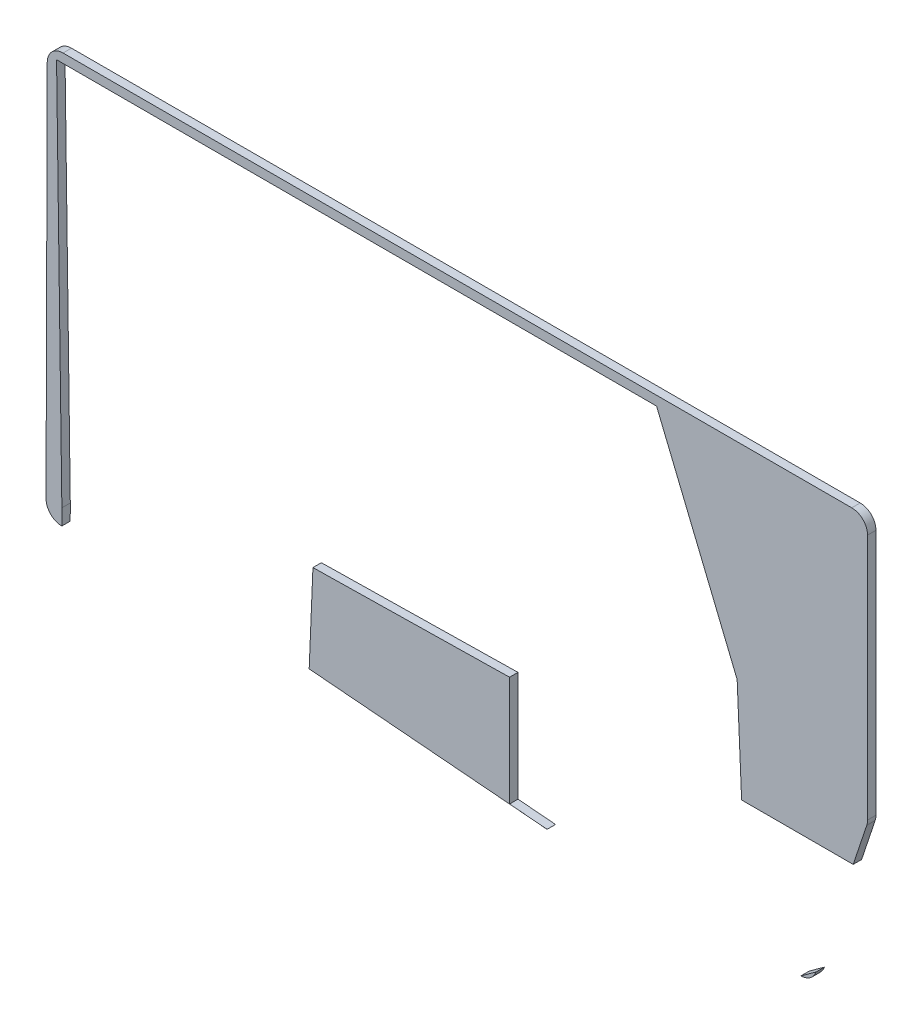
ISO-10303-21;
HEADER;
FILE_DESCRIPTION(('STEP AP214'),'2;1');
FILE_NAME('part.step','',(''),(''),'','','');
FILE_SCHEMA(('AUTOMOTIVE_DESIGN { 1 0 10303 214 1 1 1 1 }'));
ENDSEC;
DATA;
#1=APPLICATION_CONTEXT('core data for automotive mechanical design processes');
#2=APPLICATION_PROTOCOL_DEFINITION('international standard','automotive_design',2000,#1);
#3=PRODUCT_CONTEXT('',#1,'mechanical');
#4=PRODUCT('Part','Part','',(#3));
#5=PRODUCT_RELATED_PRODUCT_CATEGORY('part','',(#4));
#6=PRODUCT_DEFINITION_FORMATION('','',#4);
#7=PRODUCT_DEFINITION_CONTEXT('part definition',#1,'design');
#8=PRODUCT_DEFINITION('design','',#6,#7);
#9=PRODUCT_DEFINITION_SHAPE('','',#8);
#10=(LENGTH_UNIT() NAMED_UNIT(*) SI_UNIT(.MILLI.,.METRE.));
#11=(NAMED_UNIT(*) PLANE_ANGLE_UNIT() SI_UNIT($,.RADIAN.));
#12=(NAMED_UNIT(*) SI_UNIT($,.STERADIAN.) SOLID_ANGLE_UNIT());
#13=UNCERTAINTY_MEASURE_WITH_UNIT(LENGTH_MEASURE(1.E-05),#10,'distance_accuracy_value','');
#14=(GEOMETRIC_REPRESENTATION_CONTEXT(3) GLOBAL_UNCERTAINTY_ASSIGNED_CONTEXT((#13)) GLOBAL_UNIT_ASSIGNED_CONTEXT((#10,
#11,#12)) REPRESENTATION_CONTEXT('',''));
#15=CARTESIAN_POINT('',(0.,0.,0.));
#16=DIRECTION('',(0.,0.,1.));
#17=DIRECTION('',(1.,0.,0.));
#18=AXIS2_PLACEMENT_3D('',#15,#16,#17);
#19=CARTESIAN_POINT('',(194.025759523289,-168.3,1.6));
#20=DIRECTION('',(0.,0.,1.));
#21=DIRECTION('',(1.,0.,0.));
#22=AXIS2_PLACEMENT_3D('',#19,#20,#21);
#23=PLANE('',#22);
#24=DIRECTION('',(0.996542958828113,-0.0830790660161149,0.));
#25=VECTOR('',#24,1.);
#26=CARTESIAN_POINT('',(194.0257597,-171.3,1.6));
#27=LINE('',#26,#25);
#28=CARTESIAN_POINT('',(186.888780220454,-170.705009504022,1.6));
#29=VERTEX_POINT('',#28);
#30=CARTESIAN_POINT('',(194.0257597,-171.3,1.6));
#31=VERTEX_POINT('',#30);
#32=EDGE_CURVE('E169',#29,#31,#27,.T.);
#33=ORIENTED_EDGE('',*,*,#32,.F.);
#34=DIRECTION('',(0.,-1.,0.));
#35=VECTOR('',#34,1.);
#36=CARTESIAN_POINT('',(186.888780220454,-170.705009504022,1.6));
#37=LINE('',#36,#35);
#38=CARTESIAN_POINT('',(186.888780220454,-149.824825818157,1.6));
#39=VERTEX_POINT('',#38);
#40=EDGE_CURVE('E168',#39,#29,#37,.T.);
#41=ORIENTED_EDGE('',*,*,#40,.F.);
#42=DIRECTION('',(0.999854419750544,0.0170628047314592,0.));
#43=VECTOR('',#42,1.);
#44=CARTESIAN_POINT('',(186.888780220454,-149.824825818157,1.6));
#45=LINE('',#44,#43);
#46=CARTESIAN_POINT('',(149.504627314211,-150.46279719528,1.6));
#47=VERTEX_POINT('',#46);
#48=EDGE_CURVE('E165',#47,#39,#45,.T.);
#49=ORIENTED_EDGE('',*,*,#48,.F.);
#50=DIRECTION('',(0.0418230209844586,0.999125034675707,0.));
#51=VECTOR('',#50,1.);
#52=CARTESIAN_POINT('',(149.504627314211,-150.46279719528,1.6));
#53=LINE('',#52,#51);
#54=CARTESIAN_POINT('',(148.791233999381,-167.505304016625,1.6));
#55=VERTEX_POINT('',#54);
#56=EDGE_CURVE('E144',#55,#47,#53,.T.);
#57=ORIENTED_EDGE('',*,*,#56,.F.);
#58=DIRECTION('',(0.999999993640834,-0.000112775585568584,0.));
#59=VECTOR('',#58,1.);
#60=CARTESIAN_POINT('',(148.791233999381,-167.505304016625,1.6));
#61=LINE('',#60,#59);
#62=CARTESIAN_POINT('',(148.707395852683,-167.505294561729,1.6));
#63=VERTEX_POINT('',#62);
#64=EDGE_CURVE('E128',#63,#55,#61,.T.);
#65=ORIENTED_EDGE('',*,*,#64,.F.);
#66=CARTESIAN_POINT('',(148.529240476711,-170.5,1.6));
#67=DIRECTION('',(0.,0.,1.));
#68=DIRECTION('',(1.,0.,0.));
#69=AXIS2_PLACEMENT_3D('',#66,#67,#68);
#70=CIRCLE('',#69,2.99999999999998);
#71=CARTESIAN_POINT('',(148.7803178,-167.5105251,1.6));
#72=VERTEX_POINT('',#71);
#73=EDGE_CURVE('E141',#72,#63,#70,.T.);
#74=ORIENTED_EDGE('',*,*,#73,.F.);
#75=DIRECTION('',(0.996491626537751,-0.0836925220085229,0.));
#76=VECTOR('',#75,1.);
#77=CARTESIAN_POINT('',(148.7803178,-167.5105251,1.6));
#78=LINE('',#77,#76);
#79=CARTESIAN_POINT('',(193.7746822,-171.2894749,1.6));
#80=VERTEX_POINT('',#79);
#81=EDGE_CURVE('E157',#72,#80,#78,.T.);
#82=ORIENTED_EDGE('',*,*,#81,.T.);
#83=CARTESIAN_POINT('',(194.025759523289,-168.3,1.6));
#84=DIRECTION('',(0.,0.,1.));
#85=DIRECTION('',(1.,0.,0.));
#86=AXIS2_PLACEMENT_3D('',#83,#84,#85);
#87=CIRCLE('',#86,2.99999999999998);
#88=EDGE_CURVE('E159',#80,#31,#87,.T.);
#89=ORIENTED_EDGE('',*,*,#88,.T.);
#90=EDGE_LOOP('',(#33,#41,#49,#57,#65,#74,#82,#89));
#91=FACE_BOUND('',#90,.T.);
#92=ADVANCED_FACE('F56',(#91),#23,.T.);
#93=CARTESIAN_POINT('',(194.025759523289,-168.3,0.));
#94=DIRECTION('',(0.,0.,1.));
#95=DIRECTION('',(1.,0.,0.));
#96=AXIS2_PLACEMENT_3D('',#93,#94,#95);
#97=PLANE('',#96);
#98=DIRECTION('',(0.,-1.,0.));
#99=VECTOR('',#98,1.);
#100=CARTESIAN_POINT('',(186.888780220454,-170.705009504022,0.));
#101=LINE('',#100,#99);
#102=CARTESIAN_POINT('',(186.888780220454,-149.824825818157,0.));
#103=VERTEX_POINT('',#102);
#104=CARTESIAN_POINT('',(186.888780220454,-170.705009504022,0.));
#105=VERTEX_POINT('',#104);
#106=EDGE_CURVE('E161',#103,#105,#101,.T.);
#107=ORIENTED_EDGE('',*,*,#106,.T.);
#108=DIRECTION('',(0.996542958828113,-0.0830790660161149,0.));
#109=VECTOR('',#108,1.);
#110=CARTESIAN_POINT('',(194.0257597,-171.3,0.));
#111=LINE('',#110,#109);
#112=CARTESIAN_POINT('',(194.0257597,-171.3,0.));
#113=VERTEX_POINT('',#112);
#114=EDGE_CURVE('E175',#105,#113,#111,.T.);
#115=ORIENTED_EDGE('',*,*,#114,.T.);
#116=CARTESIAN_POINT('',(194.025759523289,-168.3,0.));
#117=DIRECTION('',(0.,0.,1.));
#118=DIRECTION('',(1.,0.,0.));
#119=AXIS2_PLACEMENT_3D('',#116,#117,#118);
#120=CIRCLE('',#119,2.99999999999998);
#121=CARTESIAN_POINT('',(193.7746822,-171.2894749,0.));
#122=VERTEX_POINT('',#121);
#123=EDGE_CURVE('E153',#122,#113,#120,.T.);
#124=ORIENTED_EDGE('',*,*,#123,.F.);
#125=DIRECTION('',(0.996491626537751,-0.0836925220085229,0.));
#126=VECTOR('',#125,1.);
#127=CARTESIAN_POINT('',(148.7803178,-167.5105251,0.));
#128=LINE('',#127,#126);
#129=CARTESIAN_POINT('',(148.7803178,-167.5105251,0.));
#130=VERTEX_POINT('',#129);
#131=EDGE_CURVE('E148',#130,#122,#128,.T.);
#132=ORIENTED_EDGE('',*,*,#131,.F.);
#133=CARTESIAN_POINT('',(148.529240476711,-170.5,0.));
#134=DIRECTION('',(0.,0.,1.));
#135=DIRECTION('',(1.,0.,0.));
#136=AXIS2_PLACEMENT_3D('',#133,#134,#135);
#137=CIRCLE('',#136,2.99999999999998);
#138=CARTESIAN_POINT('',(148.707395852683,-167.505294561729,0.));
#139=VERTEX_POINT('',#138);
#140=EDGE_CURVE('E178',#130,#139,#137,.T.);
#141=ORIENTED_EDGE('',*,*,#140,.T.);
#142=DIRECTION('',(0.999999993640834,-0.000112775585568585,0.));
#143=VECTOR('',#142,1.);
#144=CARTESIAN_POINT('',(194.025848570286,-167.510405376803,0.));
#145=LINE('',#144,#143);
#146=CARTESIAN_POINT('',(148.791233999381,-167.505304016625,0.));
#147=VERTEX_POINT('',#146);
#148=EDGE_CURVE('E130',#139,#147,#145,.T.);
#149=ORIENTED_EDGE('',*,*,#148,.T.);
#150=DIRECTION('',(0.0418230209844586,0.999125034675707,0.));
#151=VECTOR('',#150,1.);
#152=CARTESIAN_POINT('',(149.504627314211,-150.46279719528,0.));
#153=LINE('',#152,#151);
#154=CARTESIAN_POINT('',(149.504627314211,-150.46279719528,0.));
#155=VERTEX_POINT('',#154);
#156=EDGE_CURVE('E60',#147,#155,#153,.T.);
#157=ORIENTED_EDGE('',*,*,#156,.T.);
#158=DIRECTION('',(0.999854419750544,0.0170628047314592,0.));
#159=VECTOR('',#158,1.);
#160=CARTESIAN_POINT('',(186.888780220454,-149.824825818157,0.));
#161=LINE('',#160,#159);
#162=EDGE_CURVE('E180',#155,#103,#161,.T.);
#163=ORIENTED_EDGE('',*,*,#162,.T.);
#164=EDGE_LOOP('',(#107,#115,#124,#132,#141,#149,#157,#163));
#165=FACE_BOUND('',#164,.T.);
#166=ADVANCED_FACE('F58',(#165),#97,.F.);
#167=CARTESIAN_POINT('',(194.025759523289,-168.3,1.6));
#168=DIRECTION('',(0.,0.,-1.));
#169=DIRECTION('',(-1.,0.,0.));
#170=AXIS2_PLACEMENT_3D('',#167,#168,#169);
#171=CYLINDRICAL_SURFACE('',#170,2.99999999999998);
#172=ORIENTED_EDGE('',*,*,#123,.T.);
#173=DIRECTION('',(0.,0.,-1.));
#174=VECTOR('',#173,1.);
#175=CARTESIAN_POINT('',(194.0257597,-171.3,1.6));
#176=LINE('',#175,#174);
#177=EDGE_CURVE('E66',#31,#113,#176,.T.);
#178=ORIENTED_EDGE('',*,*,#177,.F.);
#179=ORIENTED_EDGE('',*,*,#88,.F.);
#180=DIRECTION('',(0.,0.,-1.));
#181=VECTOR('',#180,1.);
#182=CARTESIAN_POINT('',(193.7746822,-171.2894749,1.6));
#183=LINE('',#182,#181);
#184=EDGE_CURVE('E149',#80,#122,#183,.T.);
#185=ORIENTED_EDGE('',*,*,#184,.T.);
#186=EDGE_LOOP('',(#172,#178,#179,#185));
#187=FACE_BOUND('',#186,.T.);
#188=ADVANCED_FACE('F195',(#187),#171,.T.);
#189=CARTESIAN_POINT('',(148.529240476711,-170.5,1.6));
#190=DIRECTION('',(0.,0.,-1.));
#191=DIRECTION('',(-1.,0.,0.));
#192=AXIS2_PLACEMENT_3D('',#189,#190,#191);
#193=CYLINDRICAL_SURFACE('',#192,2.99999999999998);
#194=DIRECTION('',(0.,0.,-1.));
#195=VECTOR('',#194,1.);
#196=CARTESIAN_POINT('',(148.707395852683,-167.505294561729,1.6));
#197=LINE('',#196,#195);
#198=EDGE_CURVE('E125',#139,#63,#197,.F.);
#199=ORIENTED_EDGE('',*,*,#198,.F.);
#200=ORIENTED_EDGE('',*,*,#140,.F.);
#201=DIRECTION('',(0.,0.,-1.));
#202=VECTOR('',#201,1.);
#203=CARTESIAN_POINT('',(148.7803178,-167.5105251,1.6));
#204=LINE('',#203,#202);
#205=EDGE_CURVE('E135',#72,#130,#204,.T.);
#206=ORIENTED_EDGE('',*,*,#205,.F.);
#207=ORIENTED_EDGE('',*,*,#73,.T.);
#208=EDGE_LOOP('',(#199,#200,#206,#207));
#209=FACE_BOUND('',#208,.T.);
#210=ADVANCED_FACE('F146',(#209),#193,.F.);
#211=CARTESIAN_POINT('',(148.7803178,-167.5105251,1.6));
#212=DIRECTION('',(0.0836925220085229,0.996491626537751,0.));
#213=DIRECTION('',(-0.996491626537751,0.0836925220085229,0.));
#214=AXIS2_PLACEMENT_3D('',#211,#212,#213);
#215=PLANE('',#214);
#216=ORIENTED_EDGE('',*,*,#131,.T.);
#217=ORIENTED_EDGE('',*,*,#184,.F.);
#218=ORIENTED_EDGE('',*,*,#81,.F.);
#219=ORIENTED_EDGE('',*,*,#205,.T.);
#220=EDGE_LOOP('',(#216,#217,#218,#219));
#221=FACE_BOUND('',#220,.T.);
#222=ADVANCED_FACE('F190',(#221),#215,.F.);
#223=CARTESIAN_POINT('',(148.791233999381,-167.505304016625,0.));
#224=DIRECTION('',(-0.000112775585568584,-0.999999993640834,0.));
#225=DIRECTION('',(0.999999993640834,-0.000112775585568585,0.));
#226=AXIS2_PLACEMENT_3D('',#223,#224,#225);
#227=PLANE('',#226);
#228=ORIENTED_EDGE('',*,*,#198,.T.);
#229=ORIENTED_EDGE('',*,*,#64,.T.);
#230=DIRECTION('',(0.,0.,1.));
#231=VECTOR('',#230,1.);
#232=CARTESIAN_POINT('',(148.791233999381,-167.505304016625,0.));
#233=LINE('',#232,#231);
#234=EDGE_CURVE('E163',#147,#55,#233,.T.);
#235=ORIENTED_EDGE('',*,*,#234,.F.);
#236=ORIENTED_EDGE('',*,*,#148,.F.);
#237=EDGE_LOOP('',(#228,#229,#235,#236));
#238=FACE_BOUND('',#237,.T.);
#239=ADVANCED_FACE('F127',(#238),#227,.F.);
#240=CARTESIAN_POINT('',(149.504627314211,-150.46279719528,0.));
#241=DIRECTION('',(0.999125034675707,-0.0418230209844586,0.));
#242=DIRECTION('',(0.0418230209844586,0.999125034675707,0.));
#243=AXIS2_PLACEMENT_3D('',#240,#241,#242);
#244=PLANE('',#243);
#245=ORIENTED_EDGE('',*,*,#56,.T.);
#246=DIRECTION('',(0.,0.,1.));
#247=VECTOR('',#246,1.);
#248=CARTESIAN_POINT('',(149.504627314211,-150.46279719528,0.));
#249=LINE('',#248,#247);
#250=EDGE_CURVE('E166',#155,#47,#249,.T.);
#251=ORIENTED_EDGE('',*,*,#250,.F.);
#252=ORIENTED_EDGE('',*,*,#156,.F.);
#253=ORIENTED_EDGE('',*,*,#234,.T.);
#254=EDGE_LOOP('',(#245,#251,#252,#253));
#255=FACE_BOUND('',#254,.T.);
#256=ADVANCED_FACE('F202',(#255),#244,.F.);
#257=CARTESIAN_POINT('',(186.888780220454,-149.824825818157,0.));
#258=DIRECTION('',(0.0170628047314592,-0.999854419750544,0.));
#259=DIRECTION('',(0.999854419750544,0.0170628047314592,0.));
#260=AXIS2_PLACEMENT_3D('',#257,#258,#259);
#261=PLANE('',#260);
#262=ORIENTED_EDGE('',*,*,#48,.T.);
#263=DIRECTION('',(0.,0.,1.));
#264=VECTOR('',#263,1.);
#265=CARTESIAN_POINT('',(186.888780220454,-149.824825818157,0.));
#266=LINE('',#265,#264);
#267=EDGE_CURVE('E99',#103,#39,#266,.T.);
#268=ORIENTED_EDGE('',*,*,#267,.F.);
#269=ORIENTED_EDGE('',*,*,#162,.F.);
#270=ORIENTED_EDGE('',*,*,#250,.T.);
#271=EDGE_LOOP('',(#262,#268,#269,#270));
#272=FACE_BOUND('',#271,.T.);
#273=ADVANCED_FACE('F201',(#272),#261,.F.);
#274=CARTESIAN_POINT('',(186.888780220454,-170.705009504022,0.));
#275=DIRECTION('',(-1.,0.,0.));
#276=DIRECTION('',(0.,0.,1.));
#277=AXIS2_PLACEMENT_3D('',#274,#275,#276);
#278=PLANE('',#277);
#279=ORIENTED_EDGE('',*,*,#40,.T.);
#280=DIRECTION('',(0.,0.,1.));
#281=VECTOR('',#280,1.);
#282=CARTESIAN_POINT('',(186.888780220454,-170.705009504022,0.));
#283=LINE('',#282,#281);
#284=EDGE_CURVE('E12',#105,#29,#283,.T.);
#285=ORIENTED_EDGE('',*,*,#284,.F.);
#286=ORIENTED_EDGE('',*,*,#106,.F.);
#287=ORIENTED_EDGE('',*,*,#267,.T.);
#288=EDGE_LOOP('',(#279,#285,#286,#287));
#289=FACE_BOUND('',#288,.T.);
#290=ADVANCED_FACE('F200',(#289),#278,.F.);
#291=CARTESIAN_POINT('',(194.0257597,-171.3,0.));
#292=DIRECTION('',(-0.0830790660161149,-0.996542958828113,0.));
#293=DIRECTION('',(0.996542958828113,-0.0830790660161149,0.));
#294=AXIS2_PLACEMENT_3D('',#291,#292,#293);
#295=PLANE('',#294);
#296=ORIENTED_EDGE('',*,*,#32,.T.);
#297=ORIENTED_EDGE('',*,*,#177,.T.);
#298=ORIENTED_EDGE('',*,*,#114,.F.);
#299=ORIENTED_EDGE('',*,*,#284,.T.);
#300=EDGE_LOOP('',(#296,#297,#298,#299));
#301=FACE_BOUND('',#300,.T.);
#302=ADVANCED_FACE('F198',(#301),#295,.F.);
#303=CLOSED_SHELL('',(#92,#166,#188,#210,#222,#239,#256,#273,#290,#302));
#304=MANIFOLD_SOLID_BREP('B2',#303);
#305=CARTESIAN_POINT('',(251.95,-139.313167119495,1.6));
#306=DIRECTION('',(0.,0.,-1.));
#307=DIRECTION('',(-1.,0.,0.));
#308=AXIS2_PLACEMENT_3D('',#305,#306,#307);
#309=CYLINDRICAL_SURFACE('',#308,3.);
#310=CARTESIAN_POINT('',(251.95,-139.313167119495,0.));
#311=DIRECTION('',(0.,0.,1.));
#312=DIRECTION('',(1.,0.,0.));
#313=AXIS2_PLACEMENT_3D('',#310,#311,#312);
#314=CIRCLE('',#313,3.);
#315=CARTESIAN_POINT('',(254.7960499,-140.2618504,0.));
#316=VERTEX_POINT('',#315);
#317=CARTESIAN_POINT('',(254.95,-139.313167,0.));
#318=VERTEX_POINT('',#317);
#319=EDGE_CURVE('E451',#316,#318,#314,.T.);
#320=ORIENTED_EDGE('',*,*,#319,.T.);
#321=DIRECTION('',(0.,0.,-1.));
#322=VECTOR('',#321,1.);
#323=CARTESIAN_POINT('',(254.95,-139.313167,1.6));
#324=LINE('',#323,#322);
#325=CARTESIAN_POINT('',(254.95,-139.313167,1.6));
#326=VERTEX_POINT('',#325);
#327=EDGE_CURVE('E446',#326,#318,#324,.T.);
#328=ORIENTED_EDGE('',*,*,#327,.F.);
#329=CARTESIAN_POINT('',(251.95,-139.313167119495,1.6));
#330=DIRECTION('',(0.,0.,1.));
#331=DIRECTION('',(1.,0.,0.));
#332=AXIS2_PLACEMENT_3D('',#329,#330,#331);
#333=CIRCLE('',#332,3.);
#334=CARTESIAN_POINT('',(254.7960499,-140.2618504,1.6));
#335=VERTEX_POINT('',#334);
#336=EDGE_CURVE('E475',#335,#326,#333,.T.);
#337=ORIENTED_EDGE('',*,*,#336,.F.);
#338=DIRECTION('',(0.,0.,-1.));
#339=VECTOR('',#338,1.);
#340=CARTESIAN_POINT('',(254.7960499,-140.2618504,1.6));
#341=LINE('',#340,#339);
#342=EDGE_CURVE('E450',#335,#316,#341,.T.);
#343=ORIENTED_EDGE('',*,*,#342,.T.);
#344=EDGE_LOOP('',(#320,#328,#337,#343));
#345=FACE_BOUND('',#344,.T.);
#346=ADVANCED_FACE('F293',(#345),#309,.T.);
#347=CARTESIAN_POINT('',(254.95,-139.313167,1.6));
#348=DIRECTION('',(-1.,0.,0.));
#349=DIRECTION('',(0.,0.,1.));
#350=AXIS2_PLACEMENT_3D('',#347,#348,#349);
#351=PLANE('',#350);
#352=DIRECTION('',(0.,1.,0.));
#353=VECTOR('',#352,1.);
#354=CARTESIAN_POINT('',(254.95,-139.313167,0.));
#355=LINE('',#354,#353);
#356=CARTESIAN_POINT('',(254.95,-92.4019243,0.));
#357=VERTEX_POINT('',#356);
#358=EDGE_CURVE('E447',#318,#357,#355,.T.);
#359=ORIENTED_EDGE('',*,*,#358,.T.);
#360=DIRECTION('',(0.,0.,-1.));
#361=VECTOR('',#360,1.);
#362=CARTESIAN_POINT('',(254.95,-92.4019243,1.6));
#363=LINE('',#362,#361);
#364=CARTESIAN_POINT('',(254.95,-92.4019243,1.6));
#365=VERTEX_POINT('',#364);
#366=EDGE_CURVE('E442',#365,#357,#363,.T.);
#367=ORIENTED_EDGE('',*,*,#366,.F.);
#368=DIRECTION('',(0.,1.,0.));
#369=VECTOR('',#368,1.);
#370=CARTESIAN_POINT('',(254.95,-139.313167,1.6));
#371=LINE('',#370,#369);
#372=EDGE_CURVE('E472',#326,#365,#371,.T.);
#373=ORIENTED_EDGE('',*,*,#372,.F.);
#374=ORIENTED_EDGE('',*,*,#327,.T.);
#375=EDGE_LOOP('',(#359,#367,#373,#374));
#376=FACE_BOUND('',#375,.T.);
#377=ADVANCED_FACE('F563',(#376),#351,.F.);
#378=CARTESIAN_POINT('',(251.95,-92.4019242832938,1.6));
#379=DIRECTION('',(0.,0.,-1.));
#380=DIRECTION('',(-1.,0.,0.));
#381=AXIS2_PLACEMENT_3D('',#378,#379,#380);
#382=CYLINDRICAL_SURFACE('',#381,3.);
#383=CARTESIAN_POINT('',(251.95,-92.4019242832938,0.));
#384=DIRECTION('',(0.,0.,1.));
#385=DIRECTION('',(1.,0.,0.));
#386=AXIS2_PLACEMENT_3D('',#383,#384,#385);
#387=CIRCLE('',#386,3.);
#388=CARTESIAN_POINT('',(251.9480764,-89.4019249,0.));
#389=VERTEX_POINT('',#388);
#390=EDGE_CURVE('E443',#357,#389,#387,.T.);
#391=ORIENTED_EDGE('',*,*,#390,.T.);
#392=DIRECTION('',(0.,0.,-1.));
#393=VECTOR('',#392,1.);
#394=CARTESIAN_POINT('',(251.9480764,-89.4019249,1.6));
#395=LINE('',#394,#393);
#396=CARTESIAN_POINT('',(251.9480764,-89.4019249,1.6));
#397=VERTEX_POINT('',#396);
#398=EDGE_CURVE('E438',#397,#389,#395,.T.);
#399=ORIENTED_EDGE('',*,*,#398,.F.);
#400=CARTESIAN_POINT('',(251.95,-92.4019242832938,1.6));
#401=DIRECTION('',(0.,0.,1.));
#402=DIRECTION('',(1.,0.,0.));
#403=AXIS2_PLACEMENT_3D('',#400,#401,#402);
#404=CIRCLE('',#403,3.);
#405=EDGE_CURVE('E469',#365,#397,#404,.T.);
#406=ORIENTED_EDGE('',*,*,#405,.F.);
#407=ORIENTED_EDGE('',*,*,#366,.T.);
#408=EDGE_LOOP('',(#391,#399,#406,#407));
#409=FACE_BOUND('',#408,.T.);
#410=ADVANCED_FACE('F558',(#409),#382,.T.);
#411=CARTESIAN_POINT('',(251.9480764,-89.4019249,1.6));
#412=DIRECTION('',(0.000641231266330787,-0.99999979441121,0.));
#413=DIRECTION('',(0.999999794411211,0.000641231266330787,0.));
#414=AXIS2_PLACEMENT_3D('',#411,#412,#413);
#415=PLANE('',#414);
#416=DIRECTION('',(-0.99999979441121,-0.000641231266330787,0.));
#417=VECTOR('',#416,1.);
#418=CARTESIAN_POINT('',(251.9480764,-89.4019249,0.));
#419=LINE('',#418,#417);
#420=CARTESIAN_POINT('',(101.9884826,-89.4980837,0.));
#421=VERTEX_POINT('',#420);
#422=EDGE_CURVE('E439',#389,#421,#419,.T.);
#423=ORIENTED_EDGE('',*,*,#422,.T.);
#424=DIRECTION('',(0.,0.,-1.));
#425=VECTOR('',#424,1.);
#426=CARTESIAN_POINT('',(101.9884826,-89.4980837,1.6));
#427=LINE('',#426,#425);
#428=CARTESIAN_POINT('',(101.9884826,-89.4980837,1.6));
#429=VERTEX_POINT('',#428);
#430=EDGE_CURVE('E434',#429,#421,#427,.T.);
#431=ORIENTED_EDGE('',*,*,#430,.F.);
#432=DIRECTION('',(-0.99999979441121,-0.000641231266330787,0.));
#433=VECTOR('',#432,1.);
#434=CARTESIAN_POINT('',(251.9480764,-89.4019249,1.6));
#435=LINE('',#434,#433);
#436=EDGE_CURVE('E466',#397,#429,#435,.T.);
#437=ORIENTED_EDGE('',*,*,#436,.F.);
#438=ORIENTED_EDGE('',*,*,#398,.T.);
#439=EDGE_LOOP('',(#423,#431,#437,#438));
#440=FACE_BOUND('',#439,.T.);
#441=ADVANCED_FACE('F554',(#440),#415,.F.);
#442=CARTESIAN_POINT('',(101.990406191015,-92.4980830832995,1.6));
#443=DIRECTION('',(0.,0.,-1.));
#444=DIRECTION('',(-1.,0.,0.));
#445=AXIS2_PLACEMENT_3D('',#442,#443,#444);
#446=CYLINDRICAL_SURFACE('',#445,2.99999999999999);
#447=CARTESIAN_POINT('',(101.990406191015,-92.4980830832995,0.));
#448=DIRECTION('',(0.,0.,1.));
#449=DIRECTION('',(1.,0.,0.));
#450=AXIS2_PLACEMENT_3D('',#447,#448,#449);
#451=CIRCLE('',#450,2.99999999999999);
#452=CARTESIAN_POINT('',(98.9904216,-92.4884678,0.));
#453=VERTEX_POINT('',#452);
#454=EDGE_CURVE('E435',#421,#453,#451,.T.);
#455=ORIENTED_EDGE('',*,*,#454,.T.);
#456=DIRECTION('',(0.,0.,-1.));
#457=VECTOR('',#456,1.);
#458=CARTESIAN_POINT('',(98.9904216,-92.4884678,1.6));
#459=LINE('',#458,#457);
#460=CARTESIAN_POINT('',(98.9904216,-92.4884678,1.6));
#461=VERTEX_POINT('',#460);
#462=EDGE_CURVE('E433',#461,#453,#459,.T.);
#463=ORIENTED_EDGE('',*,*,#462,.F.);
#464=CARTESIAN_POINT('',(101.990406191015,-92.4980830832995,1.6));
#465=DIRECTION('',(0.,0.,1.));
#466=DIRECTION('',(1.,0.,0.));
#467=AXIS2_PLACEMENT_3D('',#464,#465,#466);
#468=CIRCLE('',#467,2.99999999999999);
#469=EDGE_CURVE('E463',#429,#461,#468,.T.);
#470=ORIENTED_EDGE('',*,*,#469,.F.);
#471=ORIENTED_EDGE('',*,*,#430,.T.);
#472=EDGE_LOOP('',(#455,#463,#470,#471));
#473=FACE_BOUND('',#472,.T.);
#474=ADVANCED_FACE('F550',(#473),#446,.T.);
#475=CARTESIAN_POINT('',(98.9904216,-92.4884678,1.6));
#476=DIRECTION('',(0.999994863615041,-0.00320511209401844,0.));
#477=DIRECTION('',(0.00320511209401844,0.999994863615041,0.));
#478=AXIS2_PLACEMENT_3D('',#475,#476,#477);
#479=PLANE('',#478);
#480=DIRECTION('',(-0.00320511209401844,-0.999994863615041,0.));
#481=VECTOR('',#480,1.);
#482=CARTESIAN_POINT('',(98.9904216,-92.4884678,0.));
#483=LINE('',#482,#481);
#484=CARTESIAN_POINT('',(98.7596462,-164.4903847,0.));
#485=VERTEX_POINT('',#484);
#486=EDGE_CURVE('E430',#453,#485,#483,.T.);
#487=ORIENTED_EDGE('',*,*,#486,.T.);
#488=DIRECTION('',(0.,0.,-1.));
#489=VECTOR('',#488,1.);
#490=CARTESIAN_POINT('',(98.7596462,-164.4903847,1.6));
#491=LINE('',#490,#489);
#492=CARTESIAN_POINT('',(98.7596462,-164.4903847,1.6));
#493=VERTEX_POINT('',#492);
#494=EDGE_CURVE('E423',#493,#485,#491,.T.);
#495=ORIENTED_EDGE('',*,*,#494,.F.);
#496=DIRECTION('',(-0.00320511209401844,-0.999994863615041,0.));
#497=VECTOR('',#496,1.);
#498=CARTESIAN_POINT('',(98.9904216,-92.4884678,1.6));
#499=LINE('',#498,#497);
#500=EDGE_CURVE('E460',#461,#493,#499,.T.);
#501=ORIENTED_EDGE('',*,*,#500,.F.);
#502=ORIENTED_EDGE('',*,*,#462,.T.);
#503=EDGE_LOOP('',(#487,#495,#501,#502));
#504=FACE_BOUND('',#503,.T.);
#505=ADVANCED_FACE('F544',(#504),#479,.F.);
#506=CARTESIAN_POINT('',(194.025759523289,-168.3,1.6));
#507=DIRECTION('',(0.,0.,1.));
#508=DIRECTION('',(1.,0.,0.));
#509=AXIS2_PLACEMENT_3D('',#506,#507,#508);
#510=PLANE('',#509);
#511=DIRECTION('',(-1.,0.,0.));
#512=VECTOR('',#511,1.);
#513=CARTESIAN_POINT('',(231.007722728077,-147.983990939871,1.6));
#514=LINE('',#513,#512);
#515=CARTESIAN_POINT('',(252.222003044496,-147.983990939871,1.6));
#516=VERTEX_POINT('',#515);
#517=CARTESIAN_POINT('',(231.007722728077,-147.983990939871,1.6));
#518=VERTEX_POINT('',#517);
#519=EDGE_CURVE('E485',#516,#518,#514,.T.);
#520=ORIENTED_EDGE('',*,*,#519,.F.);
#521=DIRECTION('',(0.316227766998681,0.948683297723233,0.));
#522=VECTOR('',#521,1.);
#523=CARTESIAN_POINT('',(245.1337722,-169.2486834,1.6));
#524=LINE('',#523,#522);
#525=EDGE_CURVE('E478',#516,#335,#524,.T.);
#526=ORIENTED_EDGE('',*,*,#525,.T.);
#527=ORIENTED_EDGE('',*,*,#336,.T.);
#528=ORIENTED_EDGE('',*,*,#372,.T.);
#529=ORIENTED_EDGE('',*,*,#405,.T.);
#530=ORIENTED_EDGE('',*,*,#436,.T.);
#531=ORIENTED_EDGE('',*,*,#469,.T.);
#532=ORIENTED_EDGE('',*,*,#500,.T.);
#533=CARTESIAN_POINT('',(101.759630790961,-164.5,1.6));
#534=DIRECTION('',(0.,0.,1.));
#535=DIRECTION('',(1.,0.,0.));
#536=AXIS2_PLACEMENT_3D('',#533,#534,#535);
#537=CIRCLE('',#536,3.);
#538=CARTESIAN_POINT('',(101.7596308,-167.5,1.6));
#539=VERTEX_POINT('',#538);
#540=EDGE_CURVE('E457',#493,#539,#537,.T.);
#541=ORIENTED_EDGE('',*,*,#540,.T.);
#542=DIRECTION('',(-0.00363238763850522,-0.999993402858261,0.));
#543=VECTOR('',#542,1.);
#544=CARTESIAN_POINT('',(101.7596308,-167.5,1.6));
#545=LINE('',#544,#543);
#546=CARTESIAN_POINT('',(101.770547,-164.494778897342,1.6));
#547=VERTEX_POINT('',#546);
#548=EDGE_CURVE('E405',#547,#539,#545,.T.);
#549=ORIENTED_EDGE('',*,*,#548,.F.);
#550=DIRECTION('',(0.0137757659029448,-0.999905109634803,0.));
#551=VECTOR('',#550,1.);
#552=CARTESIAN_POINT('',(101.770547,-164.494778897342,1.6));
#553=LINE('',#552,#551);
#554=CARTESIAN_POINT('',(100.760916,-91.211362,1.6));
#555=VERTEX_POINT('',#554);
#556=EDGE_CURVE('E304',#555,#547,#553,.T.);
#557=ORIENTED_EDGE('',*,*,#556,.F.);
#558=DIRECTION('',(-1.,0.,0.));
#559=VECTOR('',#558,1.);
#560=CARTESIAN_POINT('',(100.760916,-91.211362,1.6));
#561=LINE('',#560,#559);
#562=CARTESIAN_POINT('',(214.836347170596,-91.211362,1.6));
#563=VERTEX_POINT('',#562);
#564=EDGE_CURVE('E493',#563,#555,#561,.T.);
#565=ORIENTED_EDGE('',*,*,#564,.F.);
#566=DIRECTION('',(-0.379425861890164,0.925222143773541,0.));
#567=VECTOR('',#566,1.);
#568=CARTESIAN_POINT('',(214.836347170596,-91.211362,1.6));
#569=LINE('',#568,#567);
#570=CARTESIAN_POINT('',(230.15854555337,-128.574226946559,1.6));
#571=VERTEX_POINT('',#570);
#572=EDGE_CURVE('E488',#571,#563,#569,.T.);
#573=ORIENTED_EDGE('',*,*,#572,.F.);
#574=DIRECTION('',(-0.0437081898936154,0.999044340425501,0.));
#575=VECTOR('',#574,1.);
#576=CARTESIAN_POINT('',(230.15854555337,-128.574226946559,1.6));
#577=LINE('',#576,#575);
#578=EDGE_CURVE('E489',#518,#571,#577,.T.);
#579=ORIENTED_EDGE('',*,*,#578,.F.);
#580=EDGE_LOOP('',(#520,#526,#527,#528,#529,#530,#531,#532,#541,#549,#557,#565,#573,#579));
#581=FACE_BOUND('',#580,.T.);
#582=ADVANCED_FACE('F576',(#581),#510,.T.);
#583=CARTESIAN_POINT('',(194.025759523289,-168.3,0.));
#584=DIRECTION('',(0.,0.,1.));
#585=DIRECTION('',(1.,0.,0.));
#586=AXIS2_PLACEMENT_3D('',#583,#584,#585);
#587=PLANE('',#586);
#588=DIRECTION('',(0.316227766998681,0.948683297723233,0.));
#589=VECTOR('',#588,1.);
#590=CARTESIAN_POINT('',(245.1337722,-169.2486834,0.));
#591=LINE('',#590,#589);
#592=CARTESIAN_POINT('',(252.222003044496,-147.983990939871,0.));
#593=VERTEX_POINT('',#592);
#594=EDGE_CURVE('E454',#593,#316,#591,.T.);
#595=ORIENTED_EDGE('',*,*,#594,.F.);
#596=DIRECTION('',(-1.,0.,0.));
#597=VECTOR('',#596,1.);
#598=CARTESIAN_POINT('',(194.025759523289,-147.983990939871,0.));
#599=LINE('',#598,#597);
#600=CARTESIAN_POINT('',(231.007722728077,-147.983990939871,0.));
#601=VERTEX_POINT('',#600);
#602=EDGE_CURVE('E351',#593,#601,#599,.T.);
#603=ORIENTED_EDGE('',*,*,#602,.T.);
#604=DIRECTION('',(-0.0437081898936154,0.999044340425501,0.));
#605=VECTOR('',#604,1.);
#606=CARTESIAN_POINT('',(230.15854555337,-128.574226946559,0.));
#607=LINE('',#606,#605);
#608=CARTESIAN_POINT('',(230.15854555337,-128.574226946559,0.));
#609=VERTEX_POINT('',#608);
#610=EDGE_CURVE('E518',#601,#609,#607,.T.);
#611=ORIENTED_EDGE('',*,*,#610,.T.);
#612=DIRECTION('',(-0.379425861890164,0.925222143773541,0.));
#613=VECTOR('',#612,1.);
#614=CARTESIAN_POINT('',(214.836347170596,-91.211362,0.));
#615=LINE('',#614,#613);
#616=CARTESIAN_POINT('',(214.836347170596,-91.211362,0.));
#617=VERTEX_POINT('',#616);
#618=EDGE_CURVE('E514',#609,#617,#615,.T.);
#619=ORIENTED_EDGE('',*,*,#618,.T.);
#620=DIRECTION('',(-1.,0.,0.));
#621=VECTOR('',#620,1.);
#622=CARTESIAN_POINT('',(100.760916,-91.211362,0.));
#623=LINE('',#622,#621);
#624=CARTESIAN_POINT('',(100.760916,-91.211362,0.));
#625=VERTEX_POINT('',#624);
#626=EDGE_CURVE('E511',#617,#625,#623,.T.);
#627=ORIENTED_EDGE('',*,*,#626,.T.);
#628=DIRECTION('',(0.0137757659029448,-0.999905109634803,0.));
#629=VECTOR('',#628,1.);
#630=CARTESIAN_POINT('',(101.770547,-164.494778897342,0.));
#631=LINE('',#630,#629);
#632=CARTESIAN_POINT('',(101.770547,-164.494778897342,0.));
#633=VERTEX_POINT('',#632);
#634=EDGE_CURVE('E297',#625,#633,#631,.T.);
#635=ORIENTED_EDGE('',*,*,#634,.T.);
#636=DIRECTION('',(-0.00363238763850522,-0.999993402858261,0.));
#637=VECTOR('',#636,1.);
#638=CARTESIAN_POINT('',(101.7596308,-167.5,0.));
#639=LINE('',#638,#637);
#640=CARTESIAN_POINT('',(101.7596308,-167.5,0.));
#641=VERTEX_POINT('',#640);
#642=EDGE_CURVE('E402',#633,#641,#639,.T.);
#643=ORIENTED_EDGE('',*,*,#642,.T.);
#644=CARTESIAN_POINT('',(101.759630790961,-164.5,0.));
#645=DIRECTION('',(0.,0.,1.));
#646=DIRECTION('',(1.,0.,0.));
#647=AXIS2_PLACEMENT_3D('',#644,#645,#646);
#648=CIRCLE('',#647,3.);
#649=EDGE_CURVE('E417',#485,#641,#648,.T.);
#650=ORIENTED_EDGE('',*,*,#649,.F.);
#651=ORIENTED_EDGE('',*,*,#486,.F.);
#652=ORIENTED_EDGE('',*,*,#454,.F.);
#653=ORIENTED_EDGE('',*,*,#422,.F.);
#654=ORIENTED_EDGE('',*,*,#390,.F.);
#655=ORIENTED_EDGE('',*,*,#358,.F.);
#656=ORIENTED_EDGE('',*,*,#319,.F.);
#657=EDGE_LOOP('',(#595,#603,#611,#619,#627,#635,#643,#650,#651,#652,#653,#654,#655,#656));
#658=FACE_BOUND('',#657,.T.);
#659=ADVANCED_FACE('F295',(#658),#587,.F.);
#660=CARTESIAN_POINT('',(101.759630790961,-164.5,1.6));
#661=DIRECTION('',(0.,0.,-1.));
#662=DIRECTION('',(-1.,0.,0.));
#663=AXIS2_PLACEMENT_3D('',#660,#661,#662);
#664=CYLINDRICAL_SURFACE('',#663,3.);
#665=ORIENTED_EDGE('',*,*,#649,.T.);
#666=DIRECTION('',(0.,0.,-1.));
#667=VECTOR('',#666,1.);
#668=CARTESIAN_POINT('',(101.7596308,-167.5,1.6));
#669=LINE('',#668,#667);
#670=EDGE_CURVE('E399',#539,#641,#669,.T.);
#671=ORIENTED_EDGE('',*,*,#670,.F.);
#672=ORIENTED_EDGE('',*,*,#540,.F.);
#673=ORIENTED_EDGE('',*,*,#494,.T.);
#674=EDGE_LOOP('',(#665,#671,#672,#673));
#675=FACE_BOUND('',#674,.T.);
#676=ADVANCED_FACE('F421',(#675),#664,.T.);
#677=CARTESIAN_POINT('',(245.1337722,-169.2486834,1.6));
#678=DIRECTION('',(-0.948683297723233,0.316227766998681,0.));
#679=DIRECTION('',(-0.316227766998681,-0.948683297723233,0.));
#680=AXIS2_PLACEMENT_3D('',#677,#678,#679);
#681=PLANE('',#680);
#682=ORIENTED_EDGE('',*,*,#525,.F.);
#683=DIRECTION('',(0.,0.,-1.));
#684=VECTOR('',#683,1.);
#685=CARTESIAN_POINT('',(252.222003044496,-147.983990939871,1.6));
#686=LINE('',#685,#684);
#687=EDGE_CURVE('E427',#516,#593,#686,.T.);
#688=ORIENTED_EDGE('',*,*,#687,.T.);
#689=ORIENTED_EDGE('',*,*,#594,.T.);
#690=ORIENTED_EDGE('',*,*,#342,.F.);
#691=EDGE_LOOP('',(#682,#688,#689,#690));
#692=FACE_BOUND('',#691,.T.);
#693=ADVANCED_FACE('F571',(#692),#681,.F.);
#694=CARTESIAN_POINT('',(101.7596308,-167.5,0.));
#695=DIRECTION('',(-0.999993402858261,0.00363238763850522,0.));
#696=DIRECTION('',(-0.00363238763850522,-0.999993402858261,0.));
#697=AXIS2_PLACEMENT_3D('',#694,#695,#696);
#698=PLANE('',#697);
#699=ORIENTED_EDGE('',*,*,#548,.T.);
#700=ORIENTED_EDGE('',*,*,#670,.T.);
#701=ORIENTED_EDGE('',*,*,#642,.F.);
#702=DIRECTION('',(0.,0.,1.));
#703=VECTOR('',#702,1.);
#704=CARTESIAN_POINT('',(101.770547,-164.494778897342,0.));
#705=LINE('',#704,#703);
#706=EDGE_CURVE('E411',#633,#547,#705,.T.);
#707=ORIENTED_EDGE('',*,*,#706,.T.);
#708=EDGE_LOOP('',(#699,#700,#701,#707));
#709=FACE_BOUND('',#708,.T.);
#710=ADVANCED_FACE('F401',(#709),#698,.F.);
#711=CARTESIAN_POINT('',(231.007722728077,-147.983990939871,0.));
#712=DIRECTION('',(0.,1.,0.));
#713=DIRECTION('',(0.,0.,1.));
#714=AXIS2_PLACEMENT_3D('',#711,#712,#713);
#715=PLANE('',#714);
#716=ORIENTED_EDGE('',*,*,#519,.T.);
#717=DIRECTION('',(0.,0.,1.));
#718=VECTOR('',#717,1.);
#719=CARTESIAN_POINT('',(231.007722728077,-147.983990939871,0.));
#720=LINE('',#719,#718);
#721=EDGE_CURVE('E347',#601,#518,#720,.T.);
#722=ORIENTED_EDGE('',*,*,#721,.F.);
#723=ORIENTED_EDGE('',*,*,#602,.F.);
#724=ORIENTED_EDGE('',*,*,#687,.F.);
#725=EDGE_LOOP('',(#716,#722,#723,#724));
#726=FACE_BOUND('',#725,.T.);
#727=ADVANCED_FACE('F573',(#726),#715,.F.);
#728=CARTESIAN_POINT('',(230.15854555337,-128.574226946559,0.));
#729=DIRECTION('',(0.999044340425501,0.0437081898936154,0.));
#730=DIRECTION('',(-0.0437081898936154,0.999044340425501,0.));
#731=AXIS2_PLACEMENT_3D('',#728,#729,#730);
#732=PLANE('',#731);
#733=ORIENTED_EDGE('',*,*,#578,.T.);
#734=DIRECTION('',(0.,0.,1.));
#735=VECTOR('',#734,1.);
#736=CARTESIAN_POINT('',(230.15854555337,-128.574226946559,0.));
#737=LINE('',#736,#735);
#738=EDGE_CURVE('E490',#609,#571,#737,.T.);
#739=ORIENTED_EDGE('',*,*,#738,.F.);
#740=ORIENTED_EDGE('',*,*,#610,.F.);
#741=ORIENTED_EDGE('',*,*,#721,.T.);
#742=EDGE_LOOP('',(#733,#739,#740,#741));
#743=FACE_BOUND('',#742,.T.);
#744=ADVANCED_FACE('F580',(#743),#732,.F.);
#745=CARTESIAN_POINT('',(214.836347170596,-91.211362,0.));
#746=DIRECTION('',(0.925222143773541,0.379425861890164,0.));
#747=DIRECTION('',(-0.379425861890164,0.925222143773541,0.));
#748=AXIS2_PLACEMENT_3D('',#745,#746,#747);
#749=PLANE('',#748);
#750=ORIENTED_EDGE('',*,*,#572,.T.);
#751=DIRECTION('',(0.,0.,1.));
#752=VECTOR('',#751,1.);
#753=CARTESIAN_POINT('',(214.836347170596,-91.211362,0.));
#754=LINE('',#753,#752);
#755=EDGE_CURVE('E494',#617,#563,#754,.T.);
#756=ORIENTED_EDGE('',*,*,#755,.F.);
#757=ORIENTED_EDGE('',*,*,#618,.F.);
#758=ORIENTED_EDGE('',*,*,#738,.T.);
#759=EDGE_LOOP('',(#750,#756,#757,#758));
#760=FACE_BOUND('',#759,.T.);
#761=ADVANCED_FACE('F583',(#760),#749,.F.);
#762=CARTESIAN_POINT('',(100.760916,-91.211362,0.));
#763=DIRECTION('',(0.,1.,0.));
#764=DIRECTION('',(0.,0.,1.));
#765=AXIS2_PLACEMENT_3D('',#762,#763,#764);
#766=PLANE('',#765);
#767=ORIENTED_EDGE('',*,*,#564,.T.);
#768=DIRECTION('',(0.,0.,1.));
#769=VECTOR('',#768,1.);
#770=CARTESIAN_POINT('',(100.760916,-91.211362,0.));
#771=LINE('',#770,#769);
#772=EDGE_CURVE('E54',#625,#555,#771,.T.);
#773=ORIENTED_EDGE('',*,*,#772,.F.);
#774=ORIENTED_EDGE('',*,*,#626,.F.);
#775=ORIENTED_EDGE('',*,*,#755,.T.);
#776=EDGE_LOOP('',(#767,#773,#774,#775));
#777=FACE_BOUND('',#776,.T.);
#778=ADVANCED_FACE('F586',(#777),#766,.F.);
#779=CARTESIAN_POINT('',(101.770547,-164.494778897342,0.));
#780=DIRECTION('',(-0.999905109634803,-0.0137757659029448,0.));
#781=DIRECTION('',(0.0137757659029448,-0.999905109634803,0.));
#782=AXIS2_PLACEMENT_3D('',#779,#780,#781);
#783=PLANE('',#782);
#784=ORIENTED_EDGE('',*,*,#556,.T.);
#785=ORIENTED_EDGE('',*,*,#706,.F.);
#786=ORIENTED_EDGE('',*,*,#634,.F.);
#787=ORIENTED_EDGE('',*,*,#772,.T.);
#788=EDGE_LOOP('',(#784,#785,#786,#787));
#789=FACE_BOUND('',#788,.T.);
#790=ADVANCED_FACE('F588',(#789),#783,.F.);
#791=CLOSED_SHELL('',(#346,#377,#410,#441,#474,#505,#582,#659,#676,#693,#710,#727,#744,#761,
#778,#790));
#792=MANIFOLD_SOLID_BREP('B6',#791);
#793=CARTESIAN_POINT('',(194.025759523289,-168.3,1.6));
#794=DIRECTION('',(0.,0.,1.));
#795=DIRECTION('',(1.,0.,0.));
#796=AXIS2_PLACEMENT_3D('',#793,#794,#795);
#797=PLANE('',#796);
#798=DIRECTION('',(0.811242199529792,0.584710264748332,0.));
#799=VECTOR('',#798,1.);
#800=CARTESIAN_POINT('',(245.1337722,-169.2486834,1.6));
#801=LINE('',#800,#799);
#802=CARTESIAN_POINT('',(242.2877223,-171.3,1.6));
#803=VERTEX_POINT('',#802);
#804=CARTESIAN_POINT('',(245.1337722,-169.2486834,1.6));
#805=VERTEX_POINT('',#804);
#806=EDGE_CURVE('E743',#803,#805,#801,.T.);
#807=ORIENTED_EDGE('',*,*,#806,.F.);
#808=CARTESIAN_POINT('',(242.287722339832,-168.3,1.6));
#809=DIRECTION('',(0.,0.,1.));
#810=DIRECTION('',(1.,0.,0.));
#811=AXIS2_PLACEMENT_3D('',#808,#809,#810);
#812=CIRCLE('',#811,3.);
#813=EDGE_CURVE('E750',#803,#805,#812,.T.);
#814=ORIENTED_EDGE('',*,*,#813,.T.);
#815=EDGE_LOOP('',(#807,#814));
#816=FACE_BOUND('',#815,.T.);
#817=ADVANCED_FACE('F719',(#816),#797,.T.);
#818=CARTESIAN_POINT('',(194.025759523289,-168.3,0.));
#819=DIRECTION('',(0.,0.,1.));
#820=DIRECTION('',(1.,0.,0.));
#821=AXIS2_PLACEMENT_3D('',#818,#819,#820);
#822=PLANE('',#821);
#823=CARTESIAN_POINT('',(242.287722339832,-168.3,0.));
#824=DIRECTION('',(0.,0.,1.));
#825=DIRECTION('',(1.,0.,0.));
#826=AXIS2_PLACEMENT_3D('',#823,#824,#825);
#827=CIRCLE('',#826,3.);
#828=CARTESIAN_POINT('',(242.2877223,-171.3,0.));
#829=VERTEX_POINT('',#828);
#830=CARTESIAN_POINT('',(245.1337722,-169.2486834,0.));
#831=VERTEX_POINT('',#830);
#832=EDGE_CURVE('E752',#829,#831,#827,.T.);
#833=ORIENTED_EDGE('',*,*,#832,.F.);
#834=DIRECTION('',(0.811242199529792,0.584710264748332,0.));
#835=VECTOR('',#834,1.);
#836=CARTESIAN_POINT('',(245.1337722,-169.2486834,0.));
#837=LINE('',#836,#835);
#838=EDGE_CURVE('E738',#829,#831,#837,.T.);
#839=ORIENTED_EDGE('',*,*,#838,.T.);
#840=EDGE_LOOP('',(#833,#839));
#841=FACE_BOUND('',#840,.T.);
#842=ADVANCED_FACE('F757',(#841),#822,.F.);
#843=CARTESIAN_POINT('',(242.287722339832,-168.3,1.6));
#844=DIRECTION('',(0.,0.,-1.));
#845=DIRECTION('',(-1.,0.,0.));
#846=AXIS2_PLACEMENT_3D('',#843,#844,#845);
#847=CYLINDRICAL_SURFACE('',#846,3.);
#848=ORIENTED_EDGE('',*,*,#832,.T.);
#849=DIRECTION('',(0.,0.,-1.));
#850=VECTOR('',#849,1.);
#851=CARTESIAN_POINT('',(245.1337722,-169.2486834,1.6));
#852=LINE('',#851,#850);
#853=EDGE_CURVE('E727',#805,#831,#852,.T.);
#854=ORIENTED_EDGE('',*,*,#853,.F.);
#855=ORIENTED_EDGE('',*,*,#813,.F.);
#856=DIRECTION('',(0.,0.,-1.));
#857=VECTOR('',#856,1.);
#858=CARTESIAN_POINT('',(242.2877223,-171.3,1.6));
#859=LINE('',#858,#857);
#860=EDGE_CURVE('E291',#803,#829,#859,.T.);
#861=ORIENTED_EDGE('',*,*,#860,.T.);
#862=EDGE_LOOP('',(#848,#854,#855,#861));
#863=FACE_BOUND('',#862,.T.);
#864=ADVANCED_FACE('F721',(#863),#847,.T.);
#865=CARTESIAN_POINT('',(245.1337722,-169.2486834,0.));
#866=DIRECTION('',(0.584710264748332,-0.811242199529792,0.));
#867=DIRECTION('',(0.811242199529793,0.584710264748332,0.));
#868=AXIS2_PLACEMENT_3D('',#865,#866,#867);
#869=PLANE('',#868);
#870=ORIENTED_EDGE('',*,*,#806,.T.);
#871=ORIENTED_EDGE('',*,*,#853,.T.);
#872=ORIENTED_EDGE('',*,*,#838,.F.);
#873=ORIENTED_EDGE('',*,*,#860,.F.);
#874=EDGE_LOOP('',(#870,#871,#872,#873));
#875=FACE_BOUND('',#874,.T.);
#876=ADVANCED_FACE('F742',(#875),#869,.F.);
#877=CLOSED_SHELL('',(#817,#842,#864,#876));
#878=MANIFOLD_SOLID_BREP('B48',#877);
#879=ADVANCED_BREP_SHAPE_REPRESENTATION('',(#18,#304,#792,#878),#14);
#880=SHAPE_DEFINITION_REPRESENTATION(#9,#879);
ENDSEC;
END-ISO-10303-21;
